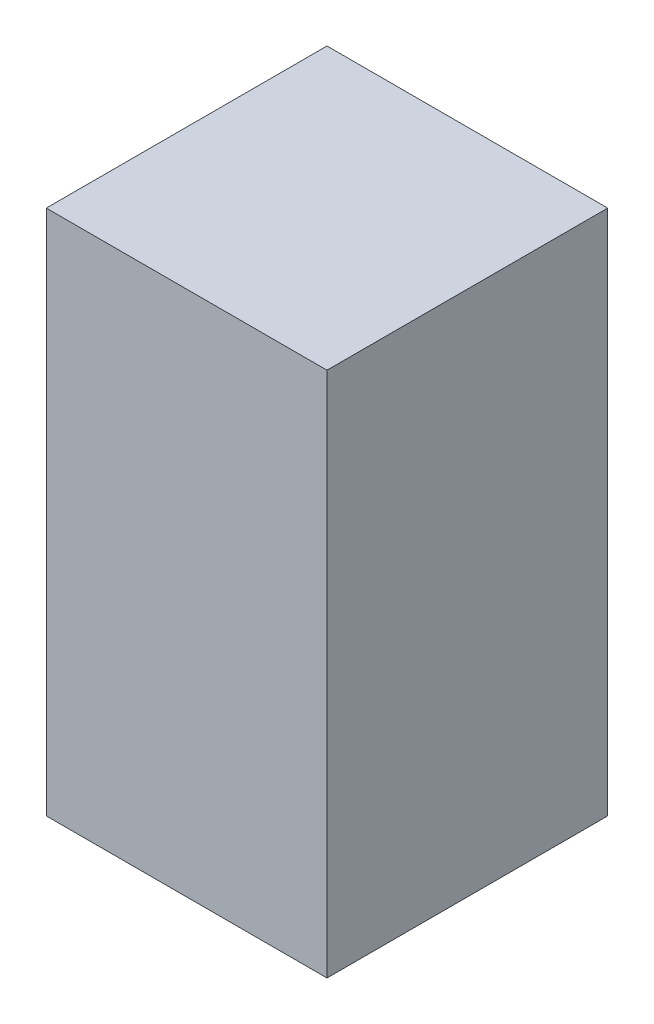
ISO-10303-21;
HEADER;
FILE_DESCRIPTION(('STEP AP214'),'2;1');
FILE_NAME('part.step','',(''),(''),'','','');
FILE_SCHEMA(('AUTOMOTIVE_DESIGN { 1 0 10303 214 1 1 1 1 }'));
ENDSEC;
DATA;
#1=APPLICATION_CONTEXT('core data for automotive mechanical design processes');
#2=APPLICATION_PROTOCOL_DEFINITION('international standard','automotive_design',2000,#1);
#3=PRODUCT_CONTEXT('',#1,'mechanical');
#4=PRODUCT('Part','Part','',(#3));
#5=PRODUCT_RELATED_PRODUCT_CATEGORY('part','',(#4));
#6=PRODUCT_DEFINITION_FORMATION('','',#4);
#7=PRODUCT_DEFINITION_CONTEXT('part definition',#1,'design');
#8=PRODUCT_DEFINITION('design','',#6,#7);
#9=PRODUCT_DEFINITION_SHAPE('','',#8);
#10=(LENGTH_UNIT() NAMED_UNIT(*) SI_UNIT(.MILLI.,.METRE.));
#11=(NAMED_UNIT(*) PLANE_ANGLE_UNIT() SI_UNIT($,.RADIAN.));
#12=(NAMED_UNIT(*) SI_UNIT($,.STERADIAN.) SOLID_ANGLE_UNIT());
#13=UNCERTAINTY_MEASURE_WITH_UNIT(LENGTH_MEASURE(1.E-05),#10,'distance_accuracy_value','');
#14=(GEOMETRIC_REPRESENTATION_CONTEXT(3) GLOBAL_UNCERTAINTY_ASSIGNED_CONTEXT((#13)) GLOBAL_UNIT_ASSIGNED_CONTEXT((#10,
#11,#12)) REPRESENTATION_CONTEXT('',''));
#15=CARTESIAN_POINT('',(0.,0.,0.));
#16=DIRECTION('',(0.,0.,1.));
#17=DIRECTION('',(1.,0.,0.));
#18=AXIS2_PLACEMENT_3D('',#15,#16,#17);
#19=CARTESIAN_POINT('',(0.,95.25,-34.4304650927678));
#20=DIRECTION('',(1.,0.,0.));
#21=DIRECTION('',(0.,0.,-1.));
#22=AXIS2_PLACEMENT_3D('',#19,#20,#21);
#23=PLANE('',#22);
#24=DIRECTION('',(0.,0.,1.));
#25=VECTOR('',#24,1.);
#26=CARTESIAN_POINT('',(0.,0.,-34.4304650927678));
#27=LINE('',#26,#25);
#28=CARTESIAN_POINT('',(0.,0.,-34.4304650927678));
#29=VERTEX_POINT('',#28);
#30=CARTESIAN_POINT('',(0.,0.,16.3695349072322));
#31=VERTEX_POINT('',#30);
#32=EDGE_CURVE('E96',#29,#31,#27,.T.);
#33=ORIENTED_EDGE('',*,*,#32,.T.);
#34=DIRECTION('',(0.,-1.,0.));
#35=VECTOR('',#34,1.);
#36=CARTESIAN_POINT('',(0.,95.25,16.3695349072322));
#37=LINE('',#36,#35);
#38=CARTESIAN_POINT('',(0.,95.25,16.3695349072322));
#39=VERTEX_POINT('',#38);
#40=EDGE_CURVE('E11',#39,#31,#37,.T.);
#41=ORIENTED_EDGE('',*,*,#40,.F.);
#42=DIRECTION('',(0.,0.,1.));
#43=VECTOR('',#42,1.);
#44=CARTESIAN_POINT('',(0.,95.25,-34.4304650927678));
#45=LINE('',#44,#43);
#46=CARTESIAN_POINT('',(0.,95.25,-34.4304650927678));
#47=VERTEX_POINT('',#46);
#48=EDGE_CURVE('E84',#47,#39,#45,.T.);
#49=ORIENTED_EDGE('',*,*,#48,.F.);
#50=DIRECTION('',(0.,-1.,0.));
#51=VECTOR('',#50,1.);
#52=CARTESIAN_POINT('',(0.,95.25,-34.4304650927678));
#53=LINE('',#52,#51);
#54=EDGE_CURVE('E92',#47,#29,#53,.T.);
#55=ORIENTED_EDGE('',*,*,#54,.T.);
#56=EDGE_LOOP('',(#33,#41,#49,#55));
#57=FACE_BOUND('',#56,.T.);
#58=ADVANCED_FACE('F33',(#57),#23,.F.);
#59=CARTESIAN_POINT('',(0.,95.25,16.3695349072322));
#60=DIRECTION('',(0.,0.,-1.));
#61=DIRECTION('',(-1.,0.,0.));
#62=AXIS2_PLACEMENT_3D('',#59,#60,#61);
#63=PLANE('',#62);
#64=DIRECTION('',(1.,0.,0.));
#65=VECTOR('',#64,1.);
#66=CARTESIAN_POINT('',(0.,0.,16.3695349072322));
#67=LINE('',#66,#65);
#68=CARTESIAN_POINT('',(50.8,0.,16.3695349072322));
#69=VERTEX_POINT('',#68);
#70=EDGE_CURVE('E88',#31,#69,#67,.T.);
#71=ORIENTED_EDGE('',*,*,#70,.T.);
#72=DIRECTION('',(0.,-1.,0.));
#73=VECTOR('',#72,1.);
#74=CARTESIAN_POINT('',(50.8,95.25,16.3695349072322));
#75=LINE('',#74,#73);
#76=CARTESIAN_POINT('',(50.8,95.25,16.3695349072322));
#77=VERTEX_POINT('',#76);
#78=EDGE_CURVE('E41',#77,#69,#75,.T.);
#79=ORIENTED_EDGE('',*,*,#78,.F.);
#80=DIRECTION('',(1.,0.,0.));
#81=VECTOR('',#80,1.);
#82=CARTESIAN_POINT('',(0.,95.25,16.3695349072322));
#83=LINE('',#82,#81);
#84=EDGE_CURVE('E79',#39,#77,#83,.T.);
#85=ORIENTED_EDGE('',*,*,#84,.F.);
#86=ORIENTED_EDGE('',*,*,#40,.T.);
#87=EDGE_LOOP('',(#71,#79,#85,#86));
#88=FACE_BOUND('',#87,.T.);
#89=ADVANCED_FACE('F87',(#88),#63,.F.);
#90=CARTESIAN_POINT('',(50.8,95.25,-34.4304650927678));
#91=DIRECTION('',(-1.,0.,0.));
#92=DIRECTION('',(0.,0.,1.));
#93=AXIS2_PLACEMENT_3D('',#90,#91,#92);
#94=PLANE('',#93);
#95=DIRECTION('',(0.,0.,-1.));
#96=VECTOR('',#95,1.);
#97=CARTESIAN_POINT('',(50.8,0.,-34.4304650927678));
#98=LINE('',#97,#96);
#99=CARTESIAN_POINT('',(50.8,0.,-34.4304650927678));
#100=VERTEX_POINT('',#99);
#101=EDGE_CURVE('E66',#69,#100,#98,.T.);
#102=ORIENTED_EDGE('',*,*,#101,.T.);
#103=DIRECTION('',(0.,-1.,0.));
#104=VECTOR('',#103,1.);
#105=CARTESIAN_POINT('',(50.8,95.25,-34.4304650927678));
#106=LINE('',#105,#104);
#107=CARTESIAN_POINT('',(50.8,95.25,-34.4304650927678));
#108=VERTEX_POINT('',#107);
#109=EDGE_CURVE('E89',#108,#100,#106,.T.);
#110=ORIENTED_EDGE('',*,*,#109,.F.);
#111=DIRECTION('',(0.,0.,-1.));
#112=VECTOR('',#111,1.);
#113=CARTESIAN_POINT('',(50.8,95.25,-34.4304650927678));
#114=LINE('',#113,#112);
#115=EDGE_CURVE('E82',#77,#108,#114,.T.);
#116=ORIENTED_EDGE('',*,*,#115,.F.);
#117=ORIENTED_EDGE('',*,*,#78,.T.);
#118=EDGE_LOOP('',(#102,#110,#116,#117));
#119=FACE_BOUND('',#118,.T.);
#120=ADVANCED_FACE('F90',(#119),#94,.F.);
#121=CARTESIAN_POINT('',(0.,95.25,-34.4304650927678));
#122=DIRECTION('',(0.,0.,1.));
#123=DIRECTION('',(1.,0.,0.));
#124=AXIS2_PLACEMENT_3D('',#121,#122,#123);
#125=PLANE('',#124);
#126=DIRECTION('',(-1.,0.,0.));
#127=VECTOR('',#126,1.);
#128=CARTESIAN_POINT('',(0.,0.,-34.4304650927678));
#129=LINE('',#128,#127);
#130=EDGE_CURVE('E72',#100,#29,#129,.T.);
#131=ORIENTED_EDGE('',*,*,#130,.T.);
#132=ORIENTED_EDGE('',*,*,#54,.F.);
#133=DIRECTION('',(-1.,0.,0.));
#134=VECTOR('',#133,1.);
#135=CARTESIAN_POINT('',(0.,95.25,-34.4304650927678));
#136=LINE('',#135,#134);
#137=EDGE_CURVE('E49',#108,#47,#136,.T.);
#138=ORIENTED_EDGE('',*,*,#137,.F.);
#139=ORIENTED_EDGE('',*,*,#109,.T.);
#140=EDGE_LOOP('',(#131,#132,#138,#139));
#141=FACE_BOUND('',#140,.T.);
#142=ADVANCED_FACE('F103',(#141),#125,.F.);
#143=CARTESIAN_POINT('',(0.,95.25,0.));
#144=DIRECTION('',(0.,1.,0.));
#145=DIRECTION('',(0.,0.,1.));
#146=AXIS2_PLACEMENT_3D('',#143,#144,#145);
#147=PLANE('',#146);
#148=ORIENTED_EDGE('',*,*,#48,.T.);
#149=ORIENTED_EDGE('',*,*,#84,.T.);
#150=ORIENTED_EDGE('',*,*,#115,.T.);
#151=ORIENTED_EDGE('',*,*,#137,.T.);
#152=EDGE_LOOP('',(#148,#149,#150,#151));
#153=FACE_BOUND('',#152,.T.);
#154=ADVANCED_FACE('F80',(#153),#147,.T.);
#155=CARTESIAN_POINT('',(0.,0.,0.));
#156=DIRECTION('',(0.,1.,0.));
#157=DIRECTION('',(0.,0.,1.));
#158=AXIS2_PLACEMENT_3D('',#155,#156,#157);
#159=PLANE('',#158);
#160=ORIENTED_EDGE('',*,*,#32,.F.);
#161=ORIENTED_EDGE('',*,*,#130,.F.);
#162=ORIENTED_EDGE('',*,*,#101,.F.);
#163=ORIENTED_EDGE('',*,*,#70,.F.);
#164=EDGE_LOOP('',(#160,#161,#162,#163));
#165=FACE_BOUND('',#164,.T.);
#166=ADVANCED_FACE('F106',(#165),#159,.F.);
#167=CLOSED_SHELL('',(#58,#89,#120,#142,#154,#166));
#168=MANIFOLD_SOLID_BREP('B2',#167);
#169=ADVANCED_BREP_SHAPE_REPRESENTATION('',(#18,#168),#14);
#170=SHAPE_DEFINITION_REPRESENTATION(#9,#169);
ENDSEC;
END-ISO-10303-21;
